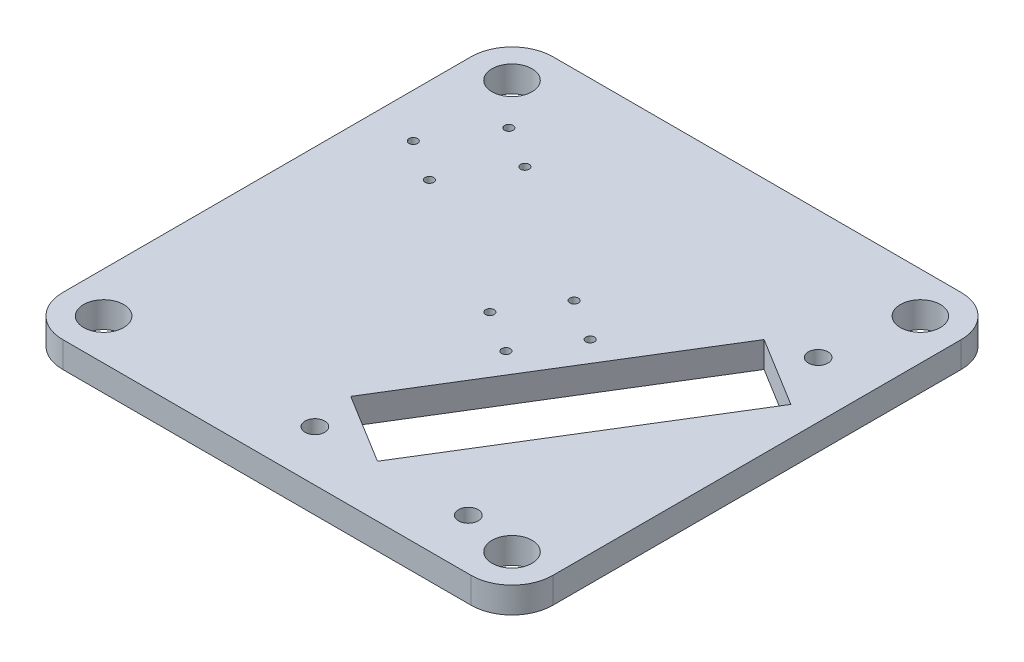
ISO-10303-21;
HEADER;
FILE_DESCRIPTION(('STEP AP214'),'2;1');
FILE_NAME('part.step','',(''),(''),'','','');
FILE_SCHEMA(('AUTOMOTIVE_DESIGN { 1 0 10303 214 1 1 1 1 }'));
ENDSEC;
DATA;
#1=APPLICATION_CONTEXT('core data for automotive mechanical design processes');
#2=APPLICATION_PROTOCOL_DEFINITION('international standard','automotive_design',2000,#1);
#3=PRODUCT_CONTEXT('',#1,'mechanical');
#4=PRODUCT('Part','Part','',(#3));
#5=PRODUCT_RELATED_PRODUCT_CATEGORY('part','',(#4));
#6=PRODUCT_DEFINITION_FORMATION('','',#4);
#7=PRODUCT_DEFINITION_CONTEXT('part definition',#1,'design');
#8=PRODUCT_DEFINITION('design','',#6,#7);
#9=PRODUCT_DEFINITION_SHAPE('','',#8);
#10=(LENGTH_UNIT() NAMED_UNIT(*) SI_UNIT(.MILLI.,.METRE.));
#11=(NAMED_UNIT(*) PLANE_ANGLE_UNIT() SI_UNIT($,.RADIAN.));
#12=(NAMED_UNIT(*) SI_UNIT($,.STERADIAN.) SOLID_ANGLE_UNIT());
#13=UNCERTAINTY_MEASURE_WITH_UNIT(LENGTH_MEASURE(1.E-05),#10,'distance_accuracy_value','');
#14=(GEOMETRIC_REPRESENTATION_CONTEXT(3) GLOBAL_UNCERTAINTY_ASSIGNED_CONTEXT((#13)) GLOBAL_UNIT_ASSIGNED_CONTEXT((#10,
#11,#12)) REPRESENTATION_CONTEXT('',''));
#15=CARTESIAN_POINT('',(0.,0.,0.));
#16=DIRECTION('',(0.,0.,1.));
#17=DIRECTION('',(1.,0.,0.));
#18=AXIS2_PLACEMENT_3D('',#15,#16,#17);
#19=CARTESIAN_POINT('',(110.,6.35,-10.));
#20=DIRECTION('',(0.,-1.,0.));
#21=DIRECTION('',(0.,0.,-1.));
#22=AXIS2_PLACEMENT_3D('',#19,#20,#21);
#23=CYLINDRICAL_SURFACE('',#22,10.);
#24=CARTESIAN_POINT('',(110.,0.,-10.));
#25=DIRECTION('',(0.,1.,0.));
#26=DIRECTION('',(0.,0.,1.));
#27=AXIS2_PLACEMENT_3D('',#24,#25,#26);
#28=CIRCLE('',#27,10.);
#29=CARTESIAN_POINT('',(110.,0.,0.));
#30=VERTEX_POINT('',#29);
#31=CARTESIAN_POINT('',(120.,0.,-10.));
#32=VERTEX_POINT('',#31);
#33=EDGE_CURVE('E209',#30,#32,#28,.T.);
#34=ORIENTED_EDGE('',*,*,#33,.T.);
#35=DIRECTION('',(0.,-1.,0.));
#36=VECTOR('',#35,1.);
#37=CARTESIAN_POINT('',(120.,6.35,-10.));
#38=LINE('',#37,#36);
#39=CARTESIAN_POINT('',(120.,6.35,-10.));
#40=VERTEX_POINT('',#39);
#41=EDGE_CURVE('E11',#40,#32,#38,.T.);
#42=ORIENTED_EDGE('',*,*,#41,.F.);
#43=CARTESIAN_POINT('',(110.,6.35,-10.));
#44=DIRECTION('',(0.,1.,0.));
#45=DIRECTION('',(0.,0.,1.));
#46=AXIS2_PLACEMENT_3D('',#43,#44,#45);
#47=CIRCLE('',#46,10.);
#48=CARTESIAN_POINT('',(110.,6.35,0.));
#49=VERTEX_POINT('',#48);
#50=EDGE_CURVE('E213',#49,#40,#47,.T.);
#51=ORIENTED_EDGE('',*,*,#50,.F.);
#52=DIRECTION('',(0.,-1.,0.));
#53=VECTOR('',#52,1.);
#54=CARTESIAN_POINT('',(110.,6.35,0.));
#55=LINE('',#54,#53);
#56=EDGE_CURVE('E239',#49,#30,#55,.T.);
#57=ORIENTED_EDGE('',*,*,#56,.T.);
#58=EDGE_LOOP('',(#34,#42,#51,#57));
#59=FACE_BOUND('',#58,.T.);
#60=ADVANCED_FACE('F39',(#59),#23,.T.);
#61=CARTESIAN_POINT('',(120.,6.35,-10.));
#62=DIRECTION('',(-1.,0.,0.));
#63=DIRECTION('',(0.,0.,1.));
#64=AXIS2_PLACEMENT_3D('',#61,#62,#63);
#65=PLANE('',#64);
#66=DIRECTION('',(0.,0.,-1.));
#67=VECTOR('',#66,1.);
#68=CARTESIAN_POINT('',(120.,0.,-10.));
#69=LINE('',#68,#67);
#70=CARTESIAN_POINT('',(120.,0.,-110.));
#71=VERTEX_POINT('',#70);
#72=EDGE_CURVE('E243',#32,#71,#69,.T.);
#73=ORIENTED_EDGE('',*,*,#72,.T.);
#74=DIRECTION('',(0.,-1.,0.));
#75=VECTOR('',#74,1.);
#76=CARTESIAN_POINT('',(120.,6.35,-110.));
#77=LINE('',#76,#75);
#78=CARTESIAN_POINT('',(120.,6.35,-110.));
#79=VERTEX_POINT('',#78);
#80=EDGE_CURVE('E47',#79,#71,#77,.T.);
#81=ORIENTED_EDGE('',*,*,#80,.F.);
#82=DIRECTION('',(0.,0.,-1.));
#83=VECTOR('',#82,1.);
#84=CARTESIAN_POINT('',(120.,6.35,-10.));
#85=LINE('',#84,#83);
#86=EDGE_CURVE('E217',#40,#79,#85,.T.);
#87=ORIENTED_EDGE('',*,*,#86,.F.);
#88=ORIENTED_EDGE('',*,*,#41,.T.);
#89=EDGE_LOOP('',(#73,#81,#87,#88));
#90=FACE_BOUND('',#89,.T.);
#91=ADVANCED_FACE('F313',(#90),#65,.F.);
#92=CARTESIAN_POINT('',(110.,6.35,-110.));
#93=DIRECTION('',(0.,-1.,0.));
#94=DIRECTION('',(0.,0.,-1.));
#95=AXIS2_PLACEMENT_3D('',#92,#93,#94);
#96=CYLINDRICAL_SURFACE('',#95,10.);
#97=CARTESIAN_POINT('',(110.,0.,-110.));
#98=DIRECTION('',(0.,1.,0.));
#99=DIRECTION('',(0.,0.,-1.));
#100=AXIS2_PLACEMENT_3D('',#97,#98,#99);
#101=CIRCLE('',#100,10.);
#102=CARTESIAN_POINT('',(110.,0.,-120.));
#103=VERTEX_POINT('',#102);
#104=EDGE_CURVE('E246',#71,#103,#101,.T.);
#105=ORIENTED_EDGE('',*,*,#104,.T.);
#106=DIRECTION('',(0.,-1.,0.));
#107=VECTOR('',#106,1.);
#108=CARTESIAN_POINT('',(110.,6.35,-120.));
#109=LINE('',#108,#107);
#110=CARTESIAN_POINT('',(110.,6.35,-120.));
#111=VERTEX_POINT('',#110);
#112=EDGE_CURVE('E282',#111,#103,#109,.T.);
#113=ORIENTED_EDGE('',*,*,#112,.F.);
#114=CARTESIAN_POINT('',(110.,6.35,-110.));
#115=DIRECTION('',(0.,1.,0.));
#116=DIRECTION('',(0.,0.,-1.));
#117=AXIS2_PLACEMENT_3D('',#114,#115,#116);
#118=CIRCLE('',#117,10.);
#119=EDGE_CURVE('E221',#79,#111,#118,.T.);
#120=ORIENTED_EDGE('',*,*,#119,.F.);
#121=ORIENTED_EDGE('',*,*,#80,.T.);
#122=EDGE_LOOP('',(#105,#113,#120,#121));
#123=FACE_BOUND('',#122,.T.);
#124=ADVANCED_FACE('F291',(#123),#96,.T.);
#125=CARTESIAN_POINT('',(10.,6.35,-120.));
#126=DIRECTION('',(0.,0.,1.));
#127=DIRECTION('',(1.,0.,0.));
#128=AXIS2_PLACEMENT_3D('',#125,#126,#127);
#129=PLANE('',#128);
#130=DIRECTION('',(-1.,0.,0.));
#131=VECTOR('',#130,1.);
#132=CARTESIAN_POINT('',(10.,0.,-120.));
#133=LINE('',#132,#131);
#134=CARTESIAN_POINT('',(10.,0.,-120.));
#135=VERTEX_POINT('',#134);
#136=EDGE_CURVE('E249',#103,#135,#133,.T.);
#137=ORIENTED_EDGE('',*,*,#136,.T.);
#138=DIRECTION('',(0.,-1.,0.));
#139=VECTOR('',#138,1.);
#140=CARTESIAN_POINT('',(10.,6.35,-120.));
#141=LINE('',#140,#139);
#142=CARTESIAN_POINT('',(10.,6.35,-120.));
#143=VERTEX_POINT('',#142);
#144=EDGE_CURVE('E278',#143,#135,#141,.T.);
#145=ORIENTED_EDGE('',*,*,#144,.F.);
#146=DIRECTION('',(-1.,0.,0.));
#147=VECTOR('',#146,1.);
#148=CARTESIAN_POINT('',(10.,6.35,-120.));
#149=LINE('',#148,#147);
#150=EDGE_CURVE('E224',#111,#143,#149,.T.);
#151=ORIENTED_EDGE('',*,*,#150,.F.);
#152=ORIENTED_EDGE('',*,*,#112,.T.);
#153=EDGE_LOOP('',(#137,#145,#151,#152));
#154=FACE_BOUND('',#153,.T.);
#155=ADVANCED_FACE('F301',(#154),#129,.F.);
#156=CARTESIAN_POINT('',(10.,6.35,-110.));
#157=DIRECTION('',(0.,-1.,0.));
#158=DIRECTION('',(0.,0.,-1.));
#159=AXIS2_PLACEMENT_3D('',#156,#157,#158);
#160=CYLINDRICAL_SURFACE('',#159,10.);
#161=CARTESIAN_POINT('',(10.,0.,-110.));
#162=DIRECTION('',(0.,1.,0.));
#163=DIRECTION('',(0.,0.,-1.));
#164=AXIS2_PLACEMENT_3D('',#161,#162,#163);
#165=CIRCLE('',#164,10.);
#166=CARTESIAN_POINT('',(0.,0.,-110.));
#167=VERTEX_POINT('',#166);
#168=EDGE_CURVE('E252',#135,#167,#165,.T.);
#169=ORIENTED_EDGE('',*,*,#168,.T.);
#170=DIRECTION('',(0.,-1.,0.));
#171=VECTOR('',#170,1.);
#172=CARTESIAN_POINT('',(0.,6.35,-110.));
#173=LINE('',#172,#171);
#174=CARTESIAN_POINT('',(0.,6.35,-110.));
#175=VERTEX_POINT('',#174);
#176=EDGE_CURVE('E274',#175,#167,#173,.T.);
#177=ORIENTED_EDGE('',*,*,#176,.F.);
#178=CARTESIAN_POINT('',(10.,6.35,-110.));
#179=DIRECTION('',(0.,1.,0.));
#180=DIRECTION('',(0.,0.,-1.));
#181=AXIS2_PLACEMENT_3D('',#178,#179,#180);
#182=CIRCLE('',#181,10.);
#183=EDGE_CURVE('E227',#143,#175,#182,.T.);
#184=ORIENTED_EDGE('',*,*,#183,.F.);
#185=ORIENTED_EDGE('',*,*,#144,.T.);
#186=EDGE_LOOP('',(#169,#177,#184,#185));
#187=FACE_BOUND('',#186,.T.);
#188=ADVANCED_FACE('F305',(#187),#160,.T.);
#189=CARTESIAN_POINT('',(0.,6.35,-10.0000000000001));
#190=DIRECTION('',(1.,0.,0.));
#191=DIRECTION('',(0.,0.,-1.));
#192=AXIS2_PLACEMENT_3D('',#189,#190,#191);
#193=PLANE('',#192);
#194=DIRECTION('',(0.,0.,1.));
#195=VECTOR('',#194,1.);
#196=CARTESIAN_POINT('',(0.,0.,-10.0000000000001));
#197=LINE('',#196,#195);
#198=CARTESIAN_POINT('',(0.,0.,-10.0000000000001));
#199=VERTEX_POINT('',#198);
#200=EDGE_CURVE('E255',#167,#199,#197,.T.);
#201=ORIENTED_EDGE('',*,*,#200,.T.);
#202=DIRECTION('',(0.,-1.,0.));
#203=VECTOR('',#202,1.);
#204=CARTESIAN_POINT('',(0.,6.35,-10.0000000000001));
#205=LINE('',#204,#203);
#206=CARTESIAN_POINT('',(0.,6.35,-10.0000000000001));
#207=VERTEX_POINT('',#206);
#208=EDGE_CURVE('E270',#207,#199,#205,.T.);
#209=ORIENTED_EDGE('',*,*,#208,.F.);
#210=DIRECTION('',(0.,0.,1.));
#211=VECTOR('',#210,1.);
#212=CARTESIAN_POINT('',(0.,6.35,-10.0000000000001));
#213=LINE('',#212,#211);
#214=EDGE_CURVE('E230',#175,#207,#213,.T.);
#215=ORIENTED_EDGE('',*,*,#214,.F.);
#216=ORIENTED_EDGE('',*,*,#176,.T.);
#217=EDGE_LOOP('',(#201,#209,#215,#216));
#218=FACE_BOUND('',#217,.T.);
#219=ADVANCED_FACE('F326',(#218),#193,.F.);
#220=CARTESIAN_POINT('',(10.,6.35,-10.));
#221=DIRECTION('',(0.,-1.,0.));
#222=DIRECTION('',(0.,0.,-1.));
#223=AXIS2_PLACEMENT_3D('',#220,#221,#222);
#224=CYLINDRICAL_SURFACE('',#223,10.);
#225=CARTESIAN_POINT('',(10.,0.,-10.));
#226=DIRECTION('',(0.,1.,0.));
#227=DIRECTION('',(0.,0.,-1.));
#228=AXIS2_PLACEMENT_3D('',#225,#226,#227);
#229=CIRCLE('',#228,10.);
#230=CARTESIAN_POINT('',(10.0000000000001,0.,0.));
#231=VERTEX_POINT('',#230);
#232=EDGE_CURVE('E258',#199,#231,#229,.T.);
#233=ORIENTED_EDGE('',*,*,#232,.T.);
#234=DIRECTION('',(0.,-1.,0.));
#235=VECTOR('',#234,1.);
#236=CARTESIAN_POINT('',(10.0000000000001,6.35,0.));
#237=LINE('',#236,#235);
#238=CARTESIAN_POINT('',(10.0000000000001,6.35,0.));
#239=VERTEX_POINT('',#238);
#240=EDGE_CURVE('E266',#239,#231,#237,.T.);
#241=ORIENTED_EDGE('',*,*,#240,.F.);
#242=CARTESIAN_POINT('',(10.,6.35,-10.));
#243=DIRECTION('',(0.,1.,0.));
#244=DIRECTION('',(0.,0.,-1.));
#245=AXIS2_PLACEMENT_3D('',#242,#243,#244);
#246=CIRCLE('',#245,10.);
#247=EDGE_CURVE('E233',#207,#239,#246,.T.);
#248=ORIENTED_EDGE('',*,*,#247,.F.);
#249=ORIENTED_EDGE('',*,*,#208,.T.);
#250=EDGE_LOOP('',(#233,#241,#248,#249));
#251=FACE_BOUND('',#250,.T.);
#252=ADVANCED_FACE('F324',(#251),#224,.T.);
#253=CARTESIAN_POINT('',(10.0000000000001,6.35,0.));
#254=DIRECTION('',(0.,0.,-1.));
#255=DIRECTION('',(-1.,0.,0.));
#256=AXIS2_PLACEMENT_3D('',#253,#254,#255);
#257=PLANE('',#256);
#258=DIRECTION('',(1.,0.,0.));
#259=VECTOR('',#258,1.);
#260=CARTESIAN_POINT('',(10.0000000000001,0.,0.));
#261=LINE('',#260,#259);
#262=EDGE_CURVE('E218',#231,#30,#261,.T.);
#263=ORIENTED_EDGE('',*,*,#262,.T.);
#264=ORIENTED_EDGE('',*,*,#56,.F.);
#265=DIRECTION('',(1.,0.,0.));
#266=VECTOR('',#265,1.);
#267=CARTESIAN_POINT('',(10.0000000000001,6.35,0.));
#268=LINE('',#267,#266);
#269=EDGE_CURVE('E236',#239,#49,#268,.T.);
#270=ORIENTED_EDGE('',*,*,#269,.F.);
#271=ORIENTED_EDGE('',*,*,#240,.T.);
#272=EDGE_LOOP('',(#263,#264,#270,#271));
#273=FACE_BOUND('',#272,.T.);
#274=ADVANCED_FACE('F319',(#273),#257,.F.);
#275=CARTESIAN_POINT('',(110.,6.35,-10.));
#276=DIRECTION('',(0.,1.,0.));
#277=DIRECTION('',(0.,0.,1.));
#278=AXIS2_PLACEMENT_3D('',#275,#276,#277);
#279=PLANE('',#278);
#280=CARTESIAN_POINT('',(66.6797489994746,6.35,-51.8272206430912));
#281=DIRECTION('',(0.,1.,0.));
#282=DIRECTION('',(0.,0.,1.));
#283=AXIS2_PLACEMENT_3D('',#280,#281,#282);
#284=CIRCLE('',#283,1.04999999999999);
#285=CARTESIAN_POINT('',(66.6797489994746,6.35,-50.7772206430912));
#286=VERTEX_POINT('',#285);
#287=EDGE_CURVE('E584',#286,#286,#284,.T.);
#288=ORIENTED_EDGE('',*,*,#287,.F.);
#289=EDGE_LOOP('',(#288));
#290=FACE_BOUND('',#289,.T.);
#291=CARTESIAN_POINT('',(19.705982614157,6.35,-99.5185749075447));
#292=DIRECTION('',(0.,1.,0.));
#293=DIRECTION('',(0.,0.,1.));
#294=AXIS2_PLACEMENT_3D('',#291,#292,#293);
#295=CIRCLE('',#294,1.04999999999999);
#296=CARTESIAN_POINT('',(19.705982614157,6.35,-98.4685749075447));
#297=VERTEX_POINT('',#296);
#298=EDGE_CURVE('E617',#297,#297,#295,.T.);
#299=ORIENTED_EDGE('',*,*,#298,.F.);
#300=EDGE_LOOP('',(#299));
#301=FACE_BOUND('',#300,.T.);
#302=CARTESIAN_POINT('',(29.9260847787013,6.35,-93.2297346530719));
#303=DIRECTION('',(0.,1.,0.));
#304=DIRECTION('',(0.,0.,1.));
#305=AXIS2_PLACEMENT_3D('',#302,#303,#304);
#306=CIRCLE('',#305,1.04999999999999);
#307=CARTESIAN_POINT('',(29.9260847787013,6.35,-92.1797346530719));
#308=VERTEX_POINT('',#307);
#309=EDGE_CURVE('E609',#308,#308,#306,.T.);
#310=ORIENTED_EDGE('',*,*,#309,.F.);
#311=EDGE_LOOP('',(#310));
#312=FACE_BOUND('',#311,.T.);
#313=CARTESIAN_POINT('',(21.0168944181981,6.35,-78.7512565866342));
#314=DIRECTION('',(0.,1.,0.));
#315=DIRECTION('',(0.,0.,1.));
#316=AXIS2_PLACEMENT_3D('',#313,#314,#315);
#317=CIRCLE('',#316,1.04999999999999);
#318=CARTESIAN_POINT('',(21.0168944181981,6.35,-77.7012565866342));
#319=VERTEX_POINT('',#318);
#320=EDGE_CURVE('E601',#319,#319,#317,.T.);
#321=ORIENTED_EDGE('',*,*,#320,.F.);
#322=EDGE_LOOP('',(#321));
#323=FACE_BOUND('',#322,.T.);
#324=CARTESIAN_POINT('',(10.7967922536538,6.35,-85.040096841107));
#325=DIRECTION('',(0.,1.,0.));
#326=DIRECTION('',(0.,0.,1.));
#327=AXIS2_PLACEMENT_3D('',#324,#325,#326);
#328=CIRCLE('',#327,1.04999999999999);
#329=CARTESIAN_POINT('',(10.7967922536538,6.35,-83.990096841107));
#330=VERTEX_POINT('',#329);
#331=EDGE_CURVE('E600',#330,#330,#328,.T.);
#332=ORIENTED_EDGE('',*,*,#331,.F.);
#333=EDGE_LOOP('',(#332));
#334=FACE_BOUND('',#333,.T.);
#335=CARTESIAN_POINT('',(64.3206971530214,6.35,-70.8911886032443));
#336=DIRECTION('',(0.,1.,0.));
#337=DIRECTION('',(0.,0.,1.));
#338=AXIS2_PLACEMENT_3D('',#335,#336,#337);
#339=CIRCLE('',#338,1.04999999999999);
#340=CARTESIAN_POINT('',(64.3206971530214,6.35,-69.8411886032443));
#341=VERTEX_POINT('',#340);
#342=EDGE_CURVE('E636',#341,#341,#339,.T.);
#343=ORIENTED_EDGE('',*,*,#342,.F.);
#344=EDGE_LOOP('',(#343));
#345=FACE_BOUND('',#344,.T.);
#346=CARTESIAN_POINT('',(74.5407993175656,6.35,-64.6023483487715));
#347=DIRECTION('',(0.,1.,0.));
#348=DIRECTION('',(0.,0.,1.));
#349=AXIS2_PLACEMENT_3D('',#346,#347,#348);
#350=CIRCLE('',#349,1.04999999999999);
#351=CARTESIAN_POINT('',(74.5407993175656,6.35,-63.5523483487715));
#352=VERTEX_POINT('',#351);
#353=EDGE_CURVE('E628',#352,#352,#350,.T.);
#354=ORIENTED_EDGE('',*,*,#353,.F.);
#355=EDGE_LOOP('',(#354));
#356=FACE_BOUND('',#355,.T.);
#357=CARTESIAN_POINT('',(56.4596468349303,6.35,-58.116060897564));
#358=DIRECTION('',(0.,1.,0.));
#359=DIRECTION('',(0.,0.,1.));
#360=AXIS2_PLACEMENT_3D('',#357,#358,#359);
#361=CIRCLE('',#360,1.04999999999999);
#362=CARTESIAN_POINT('',(56.4596468349303,6.35,-57.066060897564));
#363=VERTEX_POINT('',#362);
#364=EDGE_CURVE('E593',#363,#363,#361,.T.);
#365=ORIENTED_EDGE('',*,*,#364,.F.);
#366=EDGE_LOOP('',(#365));
#367=FACE_BOUND('',#366,.T.);
#368=CARTESIAN_POINT('',(10.,6.35,-110.));
#369=DIRECTION('',(0.,1.,0.));
#370=DIRECTION('',(0.,0.,1.));
#371=AXIS2_PLACEMENT_3D('',#368,#369,#370);
#372=CIRCLE('',#371,4.9);
#373=CARTESIAN_POINT('',(10.,6.35,-105.1));
#374=VERTEX_POINT('',#373);
#375=EDGE_CURVE('E184',#374,#374,#372,.T.);
#376=ORIENTED_EDGE('',*,*,#375,.F.);
#377=EDGE_LOOP('',(#376));
#378=FACE_BOUND('',#377,.T.);
#379=DIRECTION('',(-0.52407002120607,0.,0.851675180378687));
#380=VECTOR('',#379,1.);
#381=CARTESIAN_POINT('',(57.2914643409996,6.35,-23.2131644613569));
#382=LINE('',#381,#380);
#383=CARTESIAN_POINT('',(95.8525365013422,6.35,-85.8794242336207));
#384=VERTEX_POINT('',#383);
#385=CARTESIAN_POINT('',(57.2914643409996,6.35,-23.2131644613569));
#386=VERTEX_POINT('',#385);
#387=EDGE_CURVE('E54',#384,#386,#382,.T.);
#388=ORIENTED_EDGE('',*,*,#387,.F.);
#389=DIRECTION('',(-0.851675180378688,0.,-0.524070021206069));
#390=VECTOR('',#389,1.);
#391=CARTESIAN_POINT('',(112.886040108916,6.35,-75.3980238094993));
#392=LINE('',#391,#390);
#393=CARTESIAN_POINT('',(112.886040108916,6.35,-75.3980238094993));
#394=VERTEX_POINT('',#393);
#395=EDGE_CURVE('E149',#394,#384,#392,.T.);
#396=ORIENTED_EDGE('',*,*,#395,.F.);
#397=DIRECTION('',(0.52407002120607,0.,-0.851675180378687));
#398=VECTOR('',#397,1.);
#399=CARTESIAN_POINT('',(74.3249679485734,6.35,-12.7317640372355));
#400=LINE('',#399,#398);
#401=CARTESIAN_POINT('',(74.3249679485734,6.35,-12.7317640372355));
#402=VERTEX_POINT('',#401);
#403=EDGE_CURVE('E153',#402,#394,#400,.T.);
#404=ORIENTED_EDGE('',*,*,#403,.F.);
#405=DIRECTION('',(0.851675180378688,0.,0.524070021206069));
#406=VECTOR('',#405,1.);
#407=CARTESIAN_POINT('',(57.2914643409996,6.35,-23.2131644613569));
#408=LINE('',#407,#406);
#409=EDGE_CURVE('E165',#386,#402,#408,.T.);
#410=ORIENTED_EDGE('',*,*,#409,.F.);
#411=EDGE_LOOP('',(#388,#396,#404,#410));
#412=FACE_BOUND('',#411,.T.);
#413=CARTESIAN_POINT('',(106.27674355293,6.35,-88.6997313703742));
#414=DIRECTION('',(0.,1.,0.));
#415=DIRECTION('',(0.,0.,1.));
#416=AXIS2_PLACEMENT_3D('',#413,#414,#415);
#417=CIRCLE('',#416,2.4);
#418=CARTESIAN_POINT('',(106.27674355293,6.35,-86.2997313703742));
#419=VERTEX_POINT('',#418);
#420=EDGE_CURVE('E175',#419,#419,#417,.T.);
#421=ORIENTED_EDGE('',*,*,#420,.F.);
#422=EDGE_LOOP('',(#421));
#423=FACE_BOUND('',#422,.T.);
#424=CARTESIAN_POINT('',(59.3264475263278,6.35,-12.4));
#425=DIRECTION('',(0.,1.,0.));
#426=DIRECTION('',(0.,0.,1.));
#427=AXIS2_PLACEMENT_3D('',#424,#425,#426);
#428=CIRCLE('',#427,2.4);
#429=CARTESIAN_POINT('',(59.3264475263278,6.35,-9.99999999999999));
#430=VERTEX_POINT('',#429);
#431=EDGE_CURVE('E194',#430,#430,#428,.T.);
#432=ORIENTED_EDGE('',*,*,#431,.F.);
#433=EDGE_LOOP('',(#432));
#434=FACE_BOUND('',#433,.T.);
#435=CARTESIAN_POINT('',(110.,6.35,-10.));
#436=DIRECTION('',(0.,1.,0.));
#437=DIRECTION('',(0.,0.,1.));
#438=AXIS2_PLACEMENT_3D('',#435,#436,#437);
#439=CIRCLE('',#438,4.9);
#440=CARTESIAN_POINT('',(110.,6.35,-5.1));
#441=VERTEX_POINT('',#440);
#442=EDGE_CURVE('E590',#441,#441,#439,.T.);
#443=ORIENTED_EDGE('',*,*,#442,.F.);
#444=EDGE_LOOP('',(#443));
#445=FACE_BOUND('',#444,.T.);
#446=CARTESIAN_POINT('',(110.,6.35,-110.));
#447=DIRECTION('',(0.,1.,0.));
#448=DIRECTION('',(0.,0.,1.));
#449=AXIS2_PLACEMENT_3D('',#446,#447,#448);
#450=CIRCLE('',#449,4.89999999999998);
#451=CARTESIAN_POINT('',(110.,6.35,-105.1));
#452=VERTEX_POINT('',#451);
#453=EDGE_CURVE('E156',#452,#452,#450,.T.);
#454=ORIENTED_EDGE('',*,*,#453,.F.);
#455=EDGE_LOOP('',(#454));
#456=FACE_BOUND('',#455,.T.);
#457=CARTESIAN_POINT('',(10.,6.35,-10.));
#458=DIRECTION('',(0.,1.,0.));
#459=DIRECTION('',(0.,0.,1.));
#460=AXIS2_PLACEMENT_3D('',#457,#458,#459);
#461=CIRCLE('',#460,4.9);
#462=CARTESIAN_POINT('',(10.,6.35,-5.10000000000001));
#463=VERTEX_POINT('',#462);
#464=EDGE_CURVE('E657',#463,#463,#461,.T.);
#465=ORIENTED_EDGE('',*,*,#464,.F.);
#466=EDGE_LOOP('',(#465));
#467=FACE_BOUND('',#466,.T.);
#468=CARTESIAN_POINT('',(96.9083145396096,6.35,-12.4));
#469=DIRECTION('',(0.,1.,0.));
#470=DIRECTION('',(0.,0.,1.));
#471=AXIS2_PLACEMENT_3D('',#468,#469,#470);
#472=CIRCLE('',#471,2.4);
#473=CARTESIAN_POINT('',(96.9083145396096,6.35,-10.));
#474=VERTEX_POINT('',#473);
#475=EDGE_CURVE('E193',#474,#474,#472,.T.);
#476=ORIENTED_EDGE('',*,*,#475,.F.);
#477=EDGE_LOOP('',(#476));
#478=FACE_BOUND('',#477,.T.);
#479=ORIENTED_EDGE('',*,*,#50,.T.);
#480=ORIENTED_EDGE('',*,*,#86,.T.);
#481=ORIENTED_EDGE('',*,*,#119,.T.);
#482=ORIENTED_EDGE('',*,*,#150,.T.);
#483=ORIENTED_EDGE('',*,*,#183,.T.);
#484=ORIENTED_EDGE('',*,*,#214,.T.);
#485=ORIENTED_EDGE('',*,*,#247,.T.);
#486=ORIENTED_EDGE('',*,*,#269,.T.);
#487=EDGE_LOOP('',(#479,#480,#481,#482,#483,#484,#485,#486));
#488=FACE_BOUND('',#487,.T.);
#489=ADVANCED_FACE('F309',(#290,#301,#312,#323,#334,#345,#356,#367,#378,#412,#423,#434,#445,
#456,#467,#478,#488),#279,.T.);
#490=CARTESIAN_POINT('',(110.,0.,-10.));
#491=DIRECTION('',(0.,1.,0.));
#492=DIRECTION('',(0.,0.,1.));
#493=AXIS2_PLACEMENT_3D('',#490,#491,#492);
#494=PLANE('',#493);
#495=CARTESIAN_POINT('',(66.6797489994746,0.,-51.8272206430912));
#496=DIRECTION('',(0.,1.,0.));
#497=DIRECTION('',(0.,0.,1.));
#498=AXIS2_PLACEMENT_3D('',#495,#496,#497);
#499=CIRCLE('',#498,1.04999999999999);
#500=CARTESIAN_POINT('',(66.6797489994746,0.,-50.7772206430912));
#501=VERTEX_POINT('',#500);
#502=EDGE_CURVE('E581',#501,#501,#499,.T.);
#503=ORIENTED_EDGE('',*,*,#502,.T.);
#504=EDGE_LOOP('',(#503));
#505=FACE_BOUND('',#504,.T.);
#506=CARTESIAN_POINT('',(19.705982614157,0.,-99.5185749075447));
#507=DIRECTION('',(0.,1.,0.));
#508=DIRECTION('',(0.,0.,1.));
#509=AXIS2_PLACEMENT_3D('',#506,#507,#508);
#510=CIRCLE('',#509,1.04999999999999);
#511=CARTESIAN_POINT('',(19.705982614157,0.,-98.4685749075447));
#512=VERTEX_POINT('',#511);
#513=EDGE_CURVE('E613',#512,#512,#510,.T.);
#514=ORIENTED_EDGE('',*,*,#513,.T.);
#515=EDGE_LOOP('',(#514));
#516=FACE_BOUND('',#515,.T.);
#517=CARTESIAN_POINT('',(29.9260847787013,0.,-93.2297346530719));
#518=DIRECTION('',(0.,1.,0.));
#519=DIRECTION('',(0.,0.,1.));
#520=AXIS2_PLACEMENT_3D('',#517,#518,#519);
#521=CIRCLE('',#520,1.04999999999999);
#522=CARTESIAN_POINT('',(29.9260847787013,0.,-92.1797346530719));
#523=VERTEX_POINT('',#522);
#524=EDGE_CURVE('E605',#523,#523,#521,.T.);
#525=ORIENTED_EDGE('',*,*,#524,.T.);
#526=EDGE_LOOP('',(#525));
#527=FACE_BOUND('',#526,.T.);
#528=CARTESIAN_POINT('',(21.0168944181981,0.,-78.7512565866342));
#529=DIRECTION('',(0.,1.,0.));
#530=DIRECTION('',(0.,0.,1.));
#531=AXIS2_PLACEMENT_3D('',#528,#529,#530);
#532=CIRCLE('',#531,1.04999999999999);
#533=CARTESIAN_POINT('',(21.0168944181981,0.,-77.7012565866342));
#534=VERTEX_POINT('',#533);
#535=EDGE_CURVE('E596',#534,#534,#532,.T.);
#536=ORIENTED_EDGE('',*,*,#535,.T.);
#537=EDGE_LOOP('',(#536));
#538=FACE_BOUND('',#537,.T.);
#539=CARTESIAN_POINT('',(10.7967922536538,0.,-85.040096841107));
#540=DIRECTION('',(0.,1.,0.));
#541=DIRECTION('',(0.,0.,1.));
#542=AXIS2_PLACEMENT_3D('',#539,#540,#541);
#543=CIRCLE('',#542,1.04999999999999);
#544=CARTESIAN_POINT('',(10.7967922536538,0.,-83.990096841107));
#545=VERTEX_POINT('',#544);
#546=EDGE_CURVE('E640',#545,#545,#543,.T.);
#547=ORIENTED_EDGE('',*,*,#546,.T.);
#548=EDGE_LOOP('',(#547));
#549=FACE_BOUND('',#548,.T.);
#550=CARTESIAN_POINT('',(64.3206971530214,0.,-70.8911886032443));
#551=DIRECTION('',(0.,1.,0.));
#552=DIRECTION('',(0.,0.,1.));
#553=AXIS2_PLACEMENT_3D('',#550,#551,#552);
#554=CIRCLE('',#553,1.04999999999999);
#555=CARTESIAN_POINT('',(64.3206971530214,0.,-69.8411886032443));
#556=VERTEX_POINT('',#555);
#557=EDGE_CURVE('E632',#556,#556,#554,.T.);
#558=ORIENTED_EDGE('',*,*,#557,.T.);
#559=EDGE_LOOP('',(#558));
#560=FACE_BOUND('',#559,.T.);
#561=CARTESIAN_POINT('',(74.5407993175656,0.,-64.6023483487715));
#562=DIRECTION('',(0.,1.,0.));
#563=DIRECTION('',(0.,0.,1.));
#564=AXIS2_PLACEMENT_3D('',#561,#562,#563);
#565=CIRCLE('',#564,1.04999999999999);
#566=CARTESIAN_POINT('',(74.5407993175656,0.,-63.5523483487715));
#567=VERTEX_POINT('',#566);
#568=EDGE_CURVE('E624',#567,#567,#565,.T.);
#569=ORIENTED_EDGE('',*,*,#568,.T.);
#570=EDGE_LOOP('',(#569));
#571=FACE_BOUND('',#570,.T.);
#572=CARTESIAN_POINT('',(56.4596468349303,0.,-58.116060897564));
#573=DIRECTION('',(0.,1.,0.));
#574=DIRECTION('',(0.,0.,1.));
#575=AXIS2_PLACEMENT_3D('',#572,#573,#574);
#576=CIRCLE('',#575,1.04999999999999);
#577=CARTESIAN_POINT('',(56.4596468349303,0.,-57.066060897564));
#578=VERTEX_POINT('',#577);
#579=EDGE_CURVE('E586',#578,#578,#576,.T.);
#580=ORIENTED_EDGE('',*,*,#579,.T.);
#581=EDGE_LOOP('',(#580));
#582=FACE_BOUND('',#581,.T.);
#583=CARTESIAN_POINT('',(10.,0.,-110.));
#584=DIRECTION('',(0.,1.,0.));
#585=DIRECTION('',(0.,0.,1.));
#586=AXIS2_PLACEMENT_3D('',#583,#584,#585);
#587=CIRCLE('',#586,4.9);
#588=CARTESIAN_POINT('',(10.,0.,-105.1));
#589=VERTEX_POINT('',#588);
#590=EDGE_CURVE('E166',#589,#589,#587,.T.);
#591=ORIENTED_EDGE('',*,*,#590,.T.);
#592=EDGE_LOOP('',(#591));
#593=FACE_BOUND('',#592,.T.);
#594=DIRECTION('',(-0.851675180378688,0.,-0.524070021206069));
#595=VECTOR('',#594,1.);
#596=CARTESIAN_POINT('',(112.886040108916,0.,-75.3980238094993));
#597=LINE('',#596,#595);
#598=CARTESIAN_POINT('',(112.886040108916,0.,-75.3980238094993));
#599=VERTEX_POINT('',#598);
#600=CARTESIAN_POINT('',(95.8525365013422,0.,-85.8794242336207));
#601=VERTEX_POINT('',#600);
#602=EDGE_CURVE('E137',#599,#601,#597,.T.);
#603=ORIENTED_EDGE('',*,*,#602,.T.);
#604=DIRECTION('',(-0.52407002120607,0.,0.851675180378687));
#605=VECTOR('',#604,1.);
#606=CARTESIAN_POINT('',(57.2914643409996,0.,-23.2131644613569));
#607=LINE('',#606,#605);
#608=CARTESIAN_POINT('',(57.2914643409996,0.,-23.2131644613569));
#609=VERTEX_POINT('',#608);
#610=EDGE_CURVE('E130',#601,#609,#607,.T.);
#611=ORIENTED_EDGE('',*,*,#610,.T.);
#612=DIRECTION('',(0.851675180378688,0.,0.524070021206069));
#613=VECTOR('',#612,1.);
#614=CARTESIAN_POINT('',(57.2914643409996,0.,-23.2131644613569));
#615=LINE('',#614,#613);
#616=CARTESIAN_POINT('',(74.3249679485734,0.,-12.7317640372355));
#617=VERTEX_POINT('',#616);
#618=EDGE_CURVE('E140',#609,#617,#615,.T.);
#619=ORIENTED_EDGE('',*,*,#618,.T.);
#620=DIRECTION('',(0.52407002120607,0.,-0.851675180378687));
#621=VECTOR('',#620,1.);
#622=CARTESIAN_POINT('',(74.3249679485734,0.,-12.7317640372355));
#623=LINE('',#622,#621);
#624=EDGE_CURVE('E62',#617,#599,#623,.T.);
#625=ORIENTED_EDGE('',*,*,#624,.T.);
#626=EDGE_LOOP('',(#603,#611,#619,#625));
#627=FACE_BOUND('',#626,.T.);
#628=CARTESIAN_POINT('',(106.27674355293,0.,-88.6997313703742));
#629=DIRECTION('',(0.,1.,0.));
#630=DIRECTION('',(0.,0.,1.));
#631=AXIS2_PLACEMENT_3D('',#628,#629,#630);
#632=CIRCLE('',#631,2.4);
#633=CARTESIAN_POINT('',(106.27674355293,0.,-86.2997313703742));
#634=VERTEX_POINT('',#633);
#635=EDGE_CURVE('E198',#634,#634,#632,.T.);
#636=ORIENTED_EDGE('',*,*,#635,.T.);
#637=EDGE_LOOP('',(#636));
#638=FACE_BOUND('',#637,.T.);
#639=CARTESIAN_POINT('',(59.3264475263278,0.,-12.4));
#640=DIRECTION('',(0.,1.,0.));
#641=DIRECTION('',(0.,0.,1.));
#642=AXIS2_PLACEMENT_3D('',#639,#640,#641);
#643=CIRCLE('',#642,2.4);
#644=CARTESIAN_POINT('',(59.3264475263278,0.,-9.99999999999999));
#645=VERTEX_POINT('',#644);
#646=EDGE_CURVE('E189',#645,#645,#643,.T.);
#647=ORIENTED_EDGE('',*,*,#646,.T.);
#648=EDGE_LOOP('',(#647));
#649=FACE_BOUND('',#648,.T.);
#650=CARTESIAN_POINT('',(110.,0.,-10.));
#651=DIRECTION('',(0.,1.,0.));
#652=DIRECTION('',(0.,0.,1.));
#653=AXIS2_PLACEMENT_3D('',#650,#651,#652);
#654=CIRCLE('',#653,4.9);
#655=CARTESIAN_POINT('',(110.,0.,-5.1));
#656=VERTEX_POINT('',#655);
#657=EDGE_CURVE('E647',#656,#656,#654,.T.);
#658=ORIENTED_EDGE('',*,*,#657,.T.);
#659=EDGE_LOOP('',(#658));
#660=FACE_BOUND('',#659,.T.);
#661=CARTESIAN_POINT('',(110.,0.,-110.));
#662=DIRECTION('',(0.,1.,0.));
#663=DIRECTION('',(0.,0.,1.));
#664=AXIS2_PLACEMENT_3D('',#661,#662,#663);
#665=CIRCLE('',#664,4.89999999999998);
#666=CARTESIAN_POINT('',(110.,0.,-105.1));
#667=VERTEX_POINT('',#666);
#668=EDGE_CURVE('E660',#667,#667,#665,.T.);
#669=ORIENTED_EDGE('',*,*,#668,.T.);
#670=EDGE_LOOP('',(#669));
#671=FACE_BOUND('',#670,.T.);
#672=CARTESIAN_POINT('',(10.,0.,-10.));
#673=DIRECTION('',(0.,1.,0.));
#674=DIRECTION('',(0.,0.,1.));
#675=AXIS2_PLACEMENT_3D('',#672,#673,#674);
#676=CIRCLE('',#675,4.9);
#677=CARTESIAN_POINT('',(10.,0.,-5.10000000000001));
#678=VERTEX_POINT('',#677);
#679=EDGE_CURVE('E188',#678,#678,#676,.T.);
#680=ORIENTED_EDGE('',*,*,#679,.T.);
#681=EDGE_LOOP('',(#680));
#682=FACE_BOUND('',#681,.T.);
#683=CARTESIAN_POINT('',(96.9083145396096,0.,-12.4));
#684=DIRECTION('',(0.,1.,0.));
#685=DIRECTION('',(0.,0.,1.));
#686=AXIS2_PLACEMENT_3D('',#683,#684,#685);
#687=CIRCLE('',#686,2.4);
#688=CARTESIAN_POINT('',(96.9083145396096,0.,-10.));
#689=VERTEX_POINT('',#688);
#690=EDGE_CURVE('E205',#689,#689,#687,.T.);
#691=ORIENTED_EDGE('',*,*,#690,.T.);
#692=EDGE_LOOP('',(#691));
#693=FACE_BOUND('',#692,.T.);
#694=ORIENTED_EDGE('',*,*,#33,.F.);
#695=ORIENTED_EDGE('',*,*,#262,.F.);
#696=ORIENTED_EDGE('',*,*,#232,.F.);
#697=ORIENTED_EDGE('',*,*,#200,.F.);
#698=ORIENTED_EDGE('',*,*,#168,.F.);
#699=ORIENTED_EDGE('',*,*,#136,.F.);
#700=ORIENTED_EDGE('',*,*,#104,.F.);
#701=ORIENTED_EDGE('',*,*,#72,.F.);
#702=EDGE_LOOP('',(#694,#695,#696,#697,#698,#699,#700,#701));
#703=FACE_BOUND('',#702,.T.);
#704=ADVANCED_FACE('F145',(#505,#516,#527,#538,#549,#560,#571,#582,#593,#627,#638,#649,#660,
#671,#682,#693,#703),#494,.F.);
#705=CARTESIAN_POINT('',(96.9083145396096,0.,-12.4));
#706=DIRECTION('',(0.,1.,0.));
#707=DIRECTION('',(0.,0.,1.));
#708=AXIS2_PLACEMENT_3D('',#705,#706,#707);
#709=CYLINDRICAL_SURFACE('',#708,2.4);
#710=ORIENTED_EDGE('',*,*,#690,.F.);
#711=EDGE_LOOP('',(#710));
#712=FACE_BOUND('',#711,.T.);
#713=ORIENTED_EDGE('',*,*,#475,.T.);
#714=EDGE_LOOP('',(#713));
#715=FACE_BOUND('',#714,.T.);
#716=ADVANCED_FACE('F378',(#712,#715),#709,.F.);
#717=CARTESIAN_POINT('',(10.,0.,-10.));
#718=DIRECTION('',(0.,1.,0.));
#719=DIRECTION('',(0.,0.,1.));
#720=AXIS2_PLACEMENT_3D('',#717,#718,#719);
#721=CYLINDRICAL_SURFACE('',#720,4.9);
#722=ORIENTED_EDGE('',*,*,#679,.F.);
#723=EDGE_LOOP('',(#722));
#724=FACE_BOUND('',#723,.T.);
#725=ORIENTED_EDGE('',*,*,#464,.T.);
#726=EDGE_LOOP('',(#725));
#727=FACE_BOUND('',#726,.T.);
#728=ADVANCED_FACE('F383',(#724,#727),#721,.F.);
#729=CARTESIAN_POINT('',(110.,0.,-110.));
#730=DIRECTION('',(0.,1.,0.));
#731=DIRECTION('',(0.,0.,1.));
#732=AXIS2_PLACEMENT_3D('',#729,#730,#731);
#733=CYLINDRICAL_SURFACE('',#732,4.89999999999998);
#734=ORIENTED_EDGE('',*,*,#668,.F.);
#735=EDGE_LOOP('',(#734));
#736=FACE_BOUND('',#735,.T.);
#737=ORIENTED_EDGE('',*,*,#453,.T.);
#738=EDGE_LOOP('',(#737));
#739=FACE_BOUND('',#738,.T.);
#740=ADVANCED_FACE('F395',(#736,#739),#733,.F.);
#741=CARTESIAN_POINT('',(110.,0.,-10.));
#742=DIRECTION('',(0.,1.,0.));
#743=DIRECTION('',(0.,0.,1.));
#744=AXIS2_PLACEMENT_3D('',#741,#742,#743);
#745=CYLINDRICAL_SURFACE('',#744,4.9);
#746=ORIENTED_EDGE('',*,*,#657,.F.);
#747=EDGE_LOOP('',(#746));
#748=FACE_BOUND('',#747,.T.);
#749=ORIENTED_EDGE('',*,*,#442,.T.);
#750=EDGE_LOOP('',(#749));
#751=FACE_BOUND('',#750,.T.);
#752=ADVANCED_FACE('F405',(#748,#751),#745,.F.);
#753=CARTESIAN_POINT('',(59.3264475263278,0.,-12.4));
#754=DIRECTION('',(0.,1.,0.));
#755=DIRECTION('',(0.,0.,1.));
#756=AXIS2_PLACEMENT_3D('',#753,#754,#755);
#757=CYLINDRICAL_SURFACE('',#756,2.4);
#758=ORIENTED_EDGE('',*,*,#646,.F.);
#759=EDGE_LOOP('',(#758));
#760=FACE_BOUND('',#759,.T.);
#761=ORIENTED_EDGE('',*,*,#431,.T.);
#762=EDGE_LOOP('',(#761));
#763=FACE_BOUND('',#762,.T.);
#764=ADVANCED_FACE('F415',(#760,#763),#757,.F.);
#765=CARTESIAN_POINT('',(106.27674355293,0.,-88.6997313703742));
#766=DIRECTION('',(0.,1.,0.));
#767=DIRECTION('',(0.,0.,1.));
#768=AXIS2_PLACEMENT_3D('',#765,#766,#767);
#769=CYLINDRICAL_SURFACE('',#768,2.4);
#770=ORIENTED_EDGE('',*,*,#635,.F.);
#771=EDGE_LOOP('',(#770));
#772=FACE_BOUND('',#771,.T.);
#773=ORIENTED_EDGE('',*,*,#420,.T.);
#774=EDGE_LOOP('',(#773));
#775=FACE_BOUND('',#774,.T.);
#776=ADVANCED_FACE('F425',(#772,#775),#769,.F.);
#777=CARTESIAN_POINT('',(57.2914643409996,0.,-23.2131644613569));
#778=DIRECTION('',(-0.851675180378687,0.,-0.52407002120607));
#779=DIRECTION('',(-0.52407002120607,0.,0.851675180378687));
#780=AXIS2_PLACEMENT_3D('',#777,#778,#779);
#781=PLANE('',#780);
#782=ORIENTED_EDGE('',*,*,#387,.T.);
#783=DIRECTION('',(0.,1.,0.));
#784=VECTOR('',#783,1.);
#785=CARTESIAN_POINT('',(57.2914643409996,0.,-23.2131644613569));
#786=LINE('',#785,#784);
#787=EDGE_CURVE('E126',#609,#386,#786,.T.);
#788=ORIENTED_EDGE('',*,*,#787,.F.);
#789=ORIENTED_EDGE('',*,*,#610,.F.);
#790=DIRECTION('',(0.,1.,0.));
#791=VECTOR('',#790,1.);
#792=CARTESIAN_POINT('',(95.8525365013422,0.,-85.8794242336207));
#793=LINE('',#792,#791);
#794=EDGE_CURVE('E172',#601,#384,#793,.T.);
#795=ORIENTED_EDGE('',*,*,#794,.T.);
#796=EDGE_LOOP('',(#782,#788,#789,#795));
#797=FACE_BOUND('',#796,.T.);
#798=ADVANCED_FACE('F128',(#797),#781,.F.);
#799=CARTESIAN_POINT('',(112.886040108916,0.,-75.3980238094993));
#800=DIRECTION('',(0.524070021206069,0.,-0.851675180378687));
#801=DIRECTION('',(-0.851675180378688,0.,-0.524070021206069));
#802=AXIS2_PLACEMENT_3D('',#799,#800,#801);
#803=PLANE('',#802);
#804=ORIENTED_EDGE('',*,*,#395,.T.);
#805=ORIENTED_EDGE('',*,*,#794,.F.);
#806=ORIENTED_EDGE('',*,*,#602,.F.);
#807=DIRECTION('',(0.,1.,0.));
#808=VECTOR('',#807,1.);
#809=CARTESIAN_POINT('',(112.886040108916,0.,-75.3980238094993));
#810=LINE('',#809,#808);
#811=EDGE_CURVE('E176',#599,#394,#810,.T.);
#812=ORIENTED_EDGE('',*,*,#811,.T.);
#813=EDGE_LOOP('',(#804,#805,#806,#812));
#814=FACE_BOUND('',#813,.T.);
#815=ADVANCED_FACE('F444',(#814),#803,.F.);
#816=CARTESIAN_POINT('',(74.3249679485734,0.,-12.7317640372355));
#817=DIRECTION('',(0.851675180378687,0.,0.52407002120607));
#818=DIRECTION('',(0.52407002120607,0.,-0.851675180378687));
#819=AXIS2_PLACEMENT_3D('',#816,#817,#818);
#820=PLANE('',#819);
#821=ORIENTED_EDGE('',*,*,#403,.T.);
#822=ORIENTED_EDGE('',*,*,#811,.F.);
#823=ORIENTED_EDGE('',*,*,#624,.F.);
#824=DIRECTION('',(0.,1.,0.));
#825=VECTOR('',#824,1.);
#826=CARTESIAN_POINT('',(74.3249679485734,0.,-12.7317640372355));
#827=LINE('',#826,#825);
#828=EDGE_CURVE('E136',#617,#402,#827,.T.);
#829=ORIENTED_EDGE('',*,*,#828,.T.);
#830=EDGE_LOOP('',(#821,#822,#823,#829));
#831=FACE_BOUND('',#830,.T.);
#832=ADVANCED_FACE('F453',(#831),#820,.F.);
#833=CARTESIAN_POINT('',(57.2914643409996,0.,-23.2131644613569));
#834=DIRECTION('',(-0.524070021206069,0.,0.851675180378688));
#835=DIRECTION('',(0.851675180378688,0.,0.524070021206069));
#836=AXIS2_PLACEMENT_3D('',#833,#834,#835);
#837=PLANE('',#836);
#838=ORIENTED_EDGE('',*,*,#409,.T.);
#839=ORIENTED_EDGE('',*,*,#828,.F.);
#840=ORIENTED_EDGE('',*,*,#618,.F.);
#841=ORIENTED_EDGE('',*,*,#787,.T.);
#842=EDGE_LOOP('',(#838,#839,#840,#841));
#843=FACE_BOUND('',#842,.T.);
#844=ADVANCED_FACE('F141',(#843),#837,.F.);
#845=CARTESIAN_POINT('',(10.,0.,-110.));
#846=DIRECTION('',(0.,1.,0.));
#847=DIRECTION('',(0.,0.,1.));
#848=AXIS2_PLACEMENT_3D('',#845,#846,#847);
#849=CYLINDRICAL_SURFACE('',#848,4.9);
#850=ORIENTED_EDGE('',*,*,#590,.F.);
#851=EDGE_LOOP('',(#850));
#852=FACE_BOUND('',#851,.T.);
#853=ORIENTED_EDGE('',*,*,#375,.T.);
#854=EDGE_LOOP('',(#853));
#855=FACE_BOUND('',#854,.T.);
#856=ADVANCED_FACE('F471',(#852,#855),#849,.F.);
#857=CARTESIAN_POINT('',(56.4596468349303,0.,-58.116060897564));
#858=DIRECTION('',(0.,1.,0.));
#859=DIRECTION('',(0.,0.,1.));
#860=AXIS2_PLACEMENT_3D('',#857,#858,#859);
#861=CYLINDRICAL_SURFACE('',#860,1.04999999999999);
#862=ORIENTED_EDGE('',*,*,#579,.F.);
#863=EDGE_LOOP('',(#862));
#864=FACE_BOUND('',#863,.T.);
#865=ORIENTED_EDGE('',*,*,#364,.T.);
#866=EDGE_LOOP('',(#865));
#867=FACE_BOUND('',#866,.T.);
#868=ADVANCED_FACE('F480',(#864,#867),#861,.F.);
#869=CARTESIAN_POINT('',(74.5407993175656,0.,-64.6023483487715));
#870=DIRECTION('',(0.,1.,0.));
#871=DIRECTION('',(0.,0.,1.));
#872=AXIS2_PLACEMENT_3D('',#869,#870,#871);
#873=CYLINDRICAL_SURFACE('',#872,1.04999999999999);
#874=ORIENTED_EDGE('',*,*,#568,.F.);
#875=EDGE_LOOP('',(#874));
#876=FACE_BOUND('',#875,.T.);
#877=ORIENTED_EDGE('',*,*,#353,.T.);
#878=EDGE_LOOP('',(#877));
#879=FACE_BOUND('',#878,.T.);
#880=ADVANCED_FACE('F504',(#876,#879),#873,.F.);
#881=CARTESIAN_POINT('',(64.3206971530214,0.,-70.8911886032443));
#882=DIRECTION('',(0.,1.,0.));
#883=DIRECTION('',(0.,0.,1.));
#884=AXIS2_PLACEMENT_3D('',#881,#882,#883);
#885=CYLINDRICAL_SURFACE('',#884,1.04999999999999);
#886=ORIENTED_EDGE('',*,*,#557,.F.);
#887=EDGE_LOOP('',(#886));
#888=FACE_BOUND('',#887,.T.);
#889=ORIENTED_EDGE('',*,*,#342,.T.);
#890=EDGE_LOOP('',(#889));
#891=FACE_BOUND('',#890,.T.);
#892=ADVANCED_FACE('F514',(#888,#891),#885,.F.);
#893=CARTESIAN_POINT('',(10.7967922536538,0.,-85.040096841107));
#894=DIRECTION('',(0.,1.,0.));
#895=DIRECTION('',(0.,0.,1.));
#896=AXIS2_PLACEMENT_3D('',#893,#894,#895);
#897=CYLINDRICAL_SURFACE('',#896,1.04999999999999);
#898=ORIENTED_EDGE('',*,*,#546,.F.);
#899=EDGE_LOOP('',(#898));
#900=FACE_BOUND('',#899,.T.);
#901=ORIENTED_EDGE('',*,*,#331,.T.);
#902=EDGE_LOOP('',(#901));
#903=FACE_BOUND('',#902,.T.);
#904=ADVANCED_FACE('F524',(#900,#903),#897,.F.);
#905=CARTESIAN_POINT('',(21.0168944181981,0.,-78.7512565866342));
#906=DIRECTION('',(0.,1.,0.));
#907=DIRECTION('',(0.,0.,1.));
#908=AXIS2_PLACEMENT_3D('',#905,#906,#907);
#909=CYLINDRICAL_SURFACE('',#908,1.04999999999999);
#910=ORIENTED_EDGE('',*,*,#535,.F.);
#911=EDGE_LOOP('',(#910));
#912=FACE_BOUND('',#911,.T.);
#913=ORIENTED_EDGE('',*,*,#320,.T.);
#914=EDGE_LOOP('',(#913));
#915=FACE_BOUND('',#914,.T.);
#916=ADVANCED_FACE('F534',(#912,#915),#909,.F.);
#917=CARTESIAN_POINT('',(29.9260847787013,0.,-93.2297346530719));
#918=DIRECTION('',(0.,1.,0.));
#919=DIRECTION('',(0.,0.,1.));
#920=AXIS2_PLACEMENT_3D('',#917,#918,#919);
#921=CYLINDRICAL_SURFACE('',#920,1.04999999999999);
#922=ORIENTED_EDGE('',*,*,#524,.F.);
#923=EDGE_LOOP('',(#922));
#924=FACE_BOUND('',#923,.T.);
#925=ORIENTED_EDGE('',*,*,#309,.T.);
#926=EDGE_LOOP('',(#925));
#927=FACE_BOUND('',#926,.T.);
#928=ADVANCED_FACE('F544',(#924,#927),#921,.F.);
#929=CARTESIAN_POINT('',(19.705982614157,0.,-99.5185749075447));
#930=DIRECTION('',(0.,1.,0.));
#931=DIRECTION('',(0.,0.,1.));
#932=AXIS2_PLACEMENT_3D('',#929,#930,#931);
#933=CYLINDRICAL_SURFACE('',#932,1.04999999999999);
#934=ORIENTED_EDGE('',*,*,#513,.F.);
#935=EDGE_LOOP('',(#934));
#936=FACE_BOUND('',#935,.T.);
#937=ORIENTED_EDGE('',*,*,#298,.T.);
#938=EDGE_LOOP('',(#937));
#939=FACE_BOUND('',#938,.T.);
#940=ADVANCED_FACE('F554',(#936,#939),#933,.F.);
#941=CARTESIAN_POINT('',(66.6797489994746,0.,-51.8272206430912));
#942=DIRECTION('',(0.,1.,0.));
#943=DIRECTION('',(0.,0.,1.));
#944=AXIS2_PLACEMENT_3D('',#941,#942,#943);
#945=CYLINDRICAL_SURFACE('',#944,1.04999999999999);
#946=ORIENTED_EDGE('',*,*,#502,.F.);
#947=EDGE_LOOP('',(#946));
#948=FACE_BOUND('',#947,.T.);
#949=ORIENTED_EDGE('',*,*,#287,.T.);
#950=EDGE_LOOP('',(#949));
#951=FACE_BOUND('',#950,.T.);
#952=ADVANCED_FACE('F564',(#948,#951),#945,.F.);
#953=CLOSED_SHELL('',(#60,#91,#124,#155,#188,#219,#252,#274,#489,#704,#716,#728,#740,#752,#764,
#776,#798,#815,#832,#844,#856,#868,#880,#892,#904,#916,#928,#940,#952));
#954=MANIFOLD_SOLID_BREP('B2',#953);
#955=ADVANCED_BREP_SHAPE_REPRESENTATION('',(#18,#954),#14);
#956=SHAPE_DEFINITION_REPRESENTATION(#9,#955);
ENDSEC;
END-ISO-10303-21;
